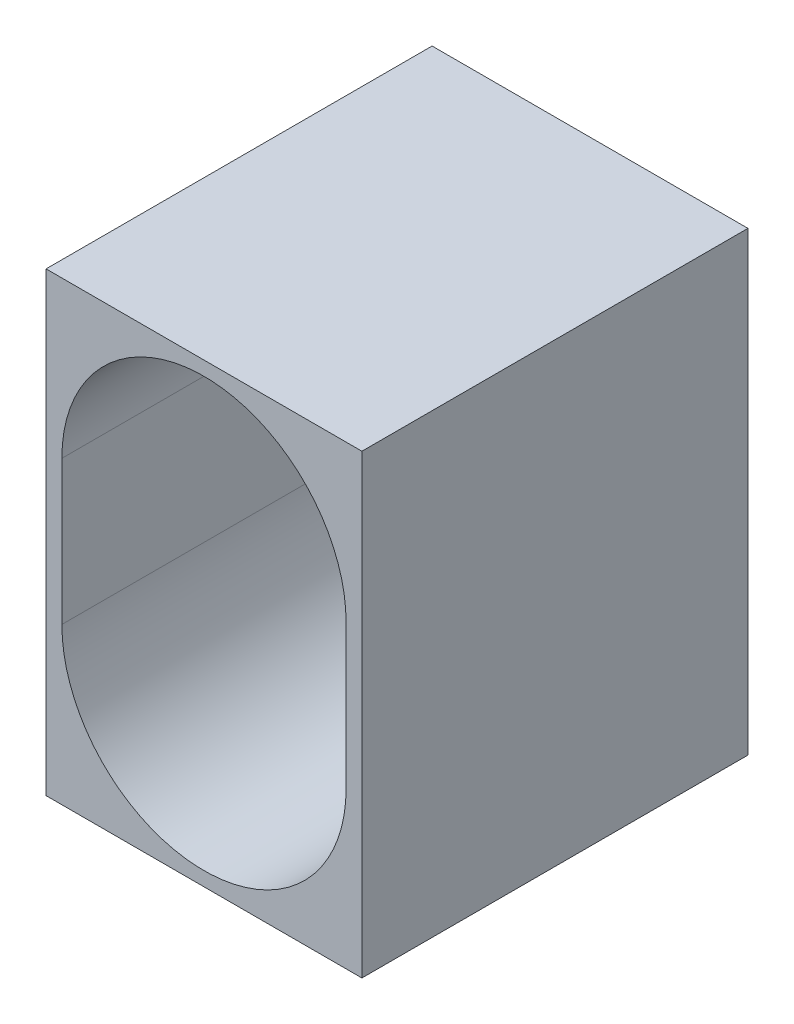
ISO-10303-21;
HEADER;
FILE_DESCRIPTION(('STEP AP214'),'2;1');
FILE_NAME('part.step','',(''),(''),'','','');
FILE_SCHEMA(('AUTOMOTIVE_DESIGN { 1 0 10303 214 1 1 1 1 }'));
ENDSEC;
DATA;
#1=APPLICATION_CONTEXT('core data for automotive mechanical design processes');
#2=APPLICATION_PROTOCOL_DEFINITION('international standard','automotive_design',2000,#1);
#3=PRODUCT_CONTEXT('',#1,'mechanical');
#4=PRODUCT('Part','Part','',(#3));
#5=PRODUCT_RELATED_PRODUCT_CATEGORY('part','',(#4));
#6=PRODUCT_DEFINITION_FORMATION('','',#4);
#7=PRODUCT_DEFINITION_CONTEXT('part definition',#1,'design');
#8=PRODUCT_DEFINITION('design','',#6,#7);
#9=PRODUCT_DEFINITION_SHAPE('','',#8);
#10=(LENGTH_UNIT() NAMED_UNIT(*) SI_UNIT(.MILLI.,.METRE.));
#11=(NAMED_UNIT(*) PLANE_ANGLE_UNIT() SI_UNIT($,.RADIAN.));
#12=(NAMED_UNIT(*) SI_UNIT($,.STERADIAN.) SOLID_ANGLE_UNIT());
#13=UNCERTAINTY_MEASURE_WITH_UNIT(LENGTH_MEASURE(1.E-05),#10,'distance_accuracy_value','');
#14=(GEOMETRIC_REPRESENTATION_CONTEXT(3) GLOBAL_UNCERTAINTY_ASSIGNED_CONTEXT((#13)) GLOBAL_UNIT_ASSIGNED_CONTEXT((#10,
#11,#12)) REPRESENTATION_CONTEXT('',''));
#15=CARTESIAN_POINT('',(0.,0.,0.));
#16=DIRECTION('',(0.,0.,1.));
#17=DIRECTION('',(1.,0.,0.));
#18=AXIS2_PLACEMENT_3D('',#15,#16,#17);
#19=CARTESIAN_POINT('',(-30.284904397773,20.560708190514,55.));
#20=DIRECTION('',(1.,0.,0.));
#21=DIRECTION('',(0.,1.,0.));
#22=AXIS2_PLACEMENT_3D('',#19,#20,#21);
#23=PLANE('',#22);
#24=DIRECTION('',(0.,-1.,0.));
#25=VECTOR('',#24,1.);
#26=CARTESIAN_POINT('',(-30.284904397773,20.560708190514,0.));
#27=LINE('',#26,#25);
#28=CARTESIAN_POINT('',(-30.284904397773,20.560708190514,0.));
#29=VERTEX_POINT('',#28);
#30=CARTESIAN_POINT('',(-30.2849043977729,-44.439291809486,0.));
#31=VERTEX_POINT('',#30);
#32=EDGE_CURVE('E186',#29,#31,#27,.T.);
#33=ORIENTED_EDGE('',*,*,#32,.T.);
#34=DIRECTION('',(0.,0.,-1.));
#35=VECTOR('',#34,1.);
#36=CARTESIAN_POINT('',(-30.2849043977729,-44.439291809486,55.));
#37=LINE('',#36,#35);
#38=CARTESIAN_POINT('',(-30.2849043977729,-44.439291809486,55.));
#39=VERTEX_POINT('',#38);
#40=EDGE_CURVE('E11',#39,#31,#37,.T.);
#41=ORIENTED_EDGE('',*,*,#40,.F.);
#42=DIRECTION('',(0.,-1.,0.));
#43=VECTOR('',#42,1.);
#44=CARTESIAN_POINT('',(-30.284904397773,20.560708190514,55.));
#45=LINE('',#44,#43);
#46=CARTESIAN_POINT('',(-30.284904397773,20.560708190514,55.));
#47=VERTEX_POINT('',#46);
#48=EDGE_CURVE('E195',#47,#39,#45,.T.);
#49=ORIENTED_EDGE('',*,*,#48,.F.);
#50=DIRECTION('',(0.,0.,-1.));
#51=VECTOR('',#50,1.);
#52=CARTESIAN_POINT('',(-30.284904397773,20.560708190514,55.));
#53=LINE('',#52,#51);
#54=EDGE_CURVE('E205',#47,#29,#53,.T.);
#55=ORIENTED_EDGE('',*,*,#54,.T.);
#56=EDGE_LOOP('',(#33,#41,#49,#55));
#57=FACE_BOUND('',#56,.T.);
#58=ADVANCED_FACE('F41',(#57),#23,.F.);
#59=CARTESIAN_POINT('',(-30.2849043977729,-44.439291809486,55.));
#60=DIRECTION('',(0.,1.,0.));
#61=DIRECTION('',(0.,0.,1.));
#62=AXIS2_PLACEMENT_3D('',#59,#60,#61);
#63=PLANE('',#62);
#64=DIRECTION('',(1.,0.,0.));
#65=VECTOR('',#64,1.);
#66=CARTESIAN_POINT('',(-30.2849043977729,-44.439291809486,0.));
#67=LINE('',#66,#65);
#68=CARTESIAN_POINT('',(14.7150956022271,-44.439291809486,0.));
#69=VERTEX_POINT('',#68);
#70=EDGE_CURVE('E209',#31,#69,#67,.T.);
#71=ORIENTED_EDGE('',*,*,#70,.T.);
#72=DIRECTION('',(0.,0.,-1.));
#73=VECTOR('',#72,1.);
#74=CARTESIAN_POINT('',(14.7150956022271,-44.439291809486,55.));
#75=LINE('',#74,#73);
#76=CARTESIAN_POINT('',(14.7150956022271,-44.439291809486,55.));
#77=VERTEX_POINT('',#76);
#78=EDGE_CURVE('E49',#77,#69,#75,.T.);
#79=ORIENTED_EDGE('',*,*,#78,.F.);
#80=DIRECTION('',(1.,0.,0.));
#81=VECTOR('',#80,1.);
#82=CARTESIAN_POINT('',(-30.2849043977729,-44.439291809486,55.));
#83=LINE('',#82,#81);
#84=EDGE_CURVE('E93',#39,#77,#83,.T.);
#85=ORIENTED_EDGE('',*,*,#84,.F.);
#86=ORIENTED_EDGE('',*,*,#40,.T.);
#87=EDGE_LOOP('',(#71,#79,#85,#86));
#88=FACE_BOUND('',#87,.T.);
#89=ADVANCED_FACE('F244',(#88),#63,.F.);
#90=CARTESIAN_POINT('',(14.715095602227,20.560708190514,55.));
#91=DIRECTION('',(-1.,0.,0.));
#92=DIRECTION('',(0.,-1.,0.));
#93=AXIS2_PLACEMENT_3D('',#90,#91,#92);
#94=PLANE('',#93);
#95=DIRECTION('',(0.,1.,0.));
#96=VECTOR('',#95,1.);
#97=CARTESIAN_POINT('',(14.715095602227,20.560708190514,0.));
#98=LINE('',#97,#96);
#99=CARTESIAN_POINT('',(14.715095602227,20.560708190514,0.));
#100=VERTEX_POINT('',#99);
#101=EDGE_CURVE('E212',#69,#100,#98,.T.);
#102=ORIENTED_EDGE('',*,*,#101,.T.);
#103=DIRECTION('',(0.,0.,-1.));
#104=VECTOR('',#103,1.);
#105=CARTESIAN_POINT('',(14.715095602227,20.560708190514,55.));
#106=LINE('',#105,#104);
#107=CARTESIAN_POINT('',(14.715095602227,20.560708190514,55.));
#108=VERTEX_POINT('',#107);
#109=EDGE_CURVE('E219',#108,#100,#106,.T.);
#110=ORIENTED_EDGE('',*,*,#109,.F.);
#111=DIRECTION('',(0.,1.,0.));
#112=VECTOR('',#111,1.);
#113=CARTESIAN_POINT('',(14.715095602227,20.560708190514,55.));
#114=LINE('',#113,#112);
#115=EDGE_CURVE('E200',#77,#108,#114,.T.);
#116=ORIENTED_EDGE('',*,*,#115,.F.);
#117=ORIENTED_EDGE('',*,*,#78,.T.);
#118=EDGE_LOOP('',(#102,#110,#116,#117));
#119=FACE_BOUND('',#118,.T.);
#120=ADVANCED_FACE('F226',(#119),#94,.F.);
#121=CARTESIAN_POINT('',(-30.284904397773,20.560708190514,55.));
#122=DIRECTION('',(0.,-1.,0.));
#123=DIRECTION('',(0.,0.,-1.));
#124=AXIS2_PLACEMENT_3D('',#121,#122,#123);
#125=PLANE('',#124);
#126=DIRECTION('',(-1.,0.,0.));
#127=VECTOR('',#126,1.);
#128=CARTESIAN_POINT('',(-30.284904397773,20.560708190514,0.));
#129=LINE('',#128,#127);
#130=EDGE_CURVE('E86',#100,#29,#129,.T.);
#131=ORIENTED_EDGE('',*,*,#130,.T.);
#132=ORIENTED_EDGE('',*,*,#54,.F.);
#133=DIRECTION('',(-1.,0.,0.));
#134=VECTOR('',#133,1.);
#135=CARTESIAN_POINT('',(-30.284904397773,20.560708190514,55.));
#136=LINE('',#135,#134);
#137=EDGE_CURVE('E65',#108,#47,#136,.T.);
#138=ORIENTED_EDGE('',*,*,#137,.F.);
#139=ORIENTED_EDGE('',*,*,#109,.T.);
#140=EDGE_LOOP('',(#131,#132,#138,#139));
#141=FACE_BOUND('',#140,.T.);
#142=ADVANCED_FACE('F234',(#141),#125,.F.);
#143=CARTESIAN_POINT('',(0.,0.,55.));
#144=DIRECTION('',(0.,0.,1.));
#145=DIRECTION('',(1.,0.,0.));
#146=AXIS2_PLACEMENT_3D('',#143,#144,#145);
#147=PLANE('',#146);
#148=CARTESIAN_POINT('',(-7.78490439777296,-22.189291809486,55.));
#149=DIRECTION('',(0.,0.,1.));
#150=DIRECTION('',(1.,0.,0.));
#151=AXIS2_PLACEMENT_3D('',#148,#149,#150);
#152=CIRCLE('',#151,20.25);
#153=CARTESIAN_POINT('',(-28.034904397773,-22.189291809486,55.));
#154=VERTEX_POINT('',#153);
#155=CARTESIAN_POINT('',(12.465095602227,-22.189291809486,55.));
#156=VERTEX_POINT('',#155);
#157=EDGE_CURVE('E56',#154,#156,#152,.T.);
#158=ORIENTED_EDGE('',*,*,#157,.F.);
#159=DIRECTION('',(0.,-1.,0.));
#160=VECTOR('',#159,1.);
#161=CARTESIAN_POINT('',(-28.034904397773,-22.189291809486,55.));
#162=LINE('',#161,#160);
#163=CARTESIAN_POINT('',(-28.034904397773,-1.68929180948604,55.));
#164=VERTEX_POINT('',#163);
#165=EDGE_CURVE('E157',#164,#154,#162,.T.);
#166=ORIENTED_EDGE('',*,*,#165,.F.);
#167=CARTESIAN_POINT('',(-7.78490439777296,-1.68929180948602,55.));
#168=DIRECTION('',(0.,0.,1.));
#169=DIRECTION('',(1.,0.,0.));
#170=AXIS2_PLACEMENT_3D('',#167,#168,#169);
#171=CIRCLE('',#170,20.25);
#172=CARTESIAN_POINT('',(12.465095602227,-1.689291809486,55.));
#173=VERTEX_POINT('',#172);
#174=EDGE_CURVE('E176',#173,#164,#171,.T.);
#175=ORIENTED_EDGE('',*,*,#174,.F.);
#176=DIRECTION('',(0.,1.,0.));
#177=VECTOR('',#176,1.);
#178=CARTESIAN_POINT('',(12.465095602227,-22.189291809486,55.));
#179=LINE('',#178,#177);
#180=EDGE_CURVE('E172',#156,#173,#179,.T.);
#181=ORIENTED_EDGE('',*,*,#180,.F.);
#182=EDGE_LOOP('',(#158,#166,#175,#181));
#183=FACE_BOUND('',#182,.T.);
#184=ORIENTED_EDGE('',*,*,#48,.T.);
#185=ORIENTED_EDGE('',*,*,#84,.T.);
#186=ORIENTED_EDGE('',*,*,#115,.T.);
#187=ORIENTED_EDGE('',*,*,#137,.T.);
#188=EDGE_LOOP('',(#184,#185,#186,#187));
#189=FACE_BOUND('',#188,.T.);
#190=ADVANCED_FACE('F236',(#183,#189),#147,.T.);
#191=CARTESIAN_POINT('',(0.,0.,0.));
#192=DIRECTION('',(0.,0.,1.));
#193=DIRECTION('',(1.,0.,0.));
#194=AXIS2_PLACEMENT_3D('',#191,#192,#193);
#195=PLANE('',#194);
#196=CARTESIAN_POINT('',(-26.2849043977729,-40.439291809486,0.));
#197=DIRECTION('',(0.,0.,-1.));
#198=DIRECTION('',(-1.,0.,0.));
#199=AXIS2_PLACEMENT_3D('',#196,#197,#198);
#200=CIRCLE('',#199,0.799999999999992);
#201=CARTESIAN_POINT('',(-27.0849043977729,-40.439291809486,0.));
#202=VERTEX_POINT('',#201);
#203=EDGE_CURVE('E131',#202,#202,#200,.T.);
#204=ORIENTED_EDGE('',*,*,#203,.F.);
#205=EDGE_LOOP('',(#204));
#206=FACE_BOUND('',#205,.T.);
#207=CARTESIAN_POINT('',(10.715095602227,-40.439291809486,0.));
#208=DIRECTION('',(0.,0.,-1.));
#209=DIRECTION('',(-1.,0.,0.));
#210=AXIS2_PLACEMENT_3D('',#207,#208,#209);
#211=CIRCLE('',#210,0.79999999999999);
#212=CARTESIAN_POINT('',(9.91509560222706,-40.439291809486,0.));
#213=VERTEX_POINT('',#212);
#214=EDGE_CURVE('E130',#213,#213,#211,.T.);
#215=ORIENTED_EDGE('',*,*,#214,.F.);
#216=EDGE_LOOP('',(#215));
#217=FACE_BOUND('',#216,.T.);
#218=CARTESIAN_POINT('',(-7.78490439777295,-16.439291809486,0.));
#219=DIRECTION('',(0.,0.,-1.));
#220=DIRECTION('',(-1.,0.,0.));
#221=AXIS2_PLACEMENT_3D('',#218,#219,#220);
#222=CIRCLE('',#221,2.70509999999999);
#223=CARTESIAN_POINT('',(-10.4900043977729,-16.439291809486,0.));
#224=VERTEX_POINT('',#223);
#225=EDGE_CURVE('E144',#224,#224,#222,.T.);
#226=ORIENTED_EDGE('',*,*,#225,.F.);
#227=EDGE_LOOP('',(#226));
#228=FACE_BOUND('',#227,.T.);
#229=ORIENTED_EDGE('',*,*,#32,.F.);
#230=ORIENTED_EDGE('',*,*,#130,.F.);
#231=ORIENTED_EDGE('',*,*,#101,.F.);
#232=ORIENTED_EDGE('',*,*,#70,.F.);
#233=EDGE_LOOP('',(#229,#230,#231,#232));
#234=FACE_BOUND('',#233,.T.);
#235=ADVANCED_FACE('F230',(#206,#217,#228,#234),#195,.F.);
#236=CARTESIAN_POINT('',(-7.78490439777296,-22.189291809486,2.5));
#237=DIRECTION('',(0.,0.,1.));
#238=DIRECTION('',(1.,0.,0.));
#239=AXIS2_PLACEMENT_3D('',#236,#237,#238);
#240=CYLINDRICAL_SURFACE('',#239,20.25);
#241=ORIENTED_EDGE('',*,*,#157,.T.);
#242=DIRECTION('',(0.,0.,1.));
#243=VECTOR('',#242,1.);
#244=CARTESIAN_POINT('',(12.465095602227,-22.189291809486,2.5));
#245=LINE('',#244,#243);
#246=CARTESIAN_POINT('',(12.465095602227,-22.189291809486,2.5));
#247=VERTEX_POINT('',#246);
#248=EDGE_CURVE('E169',#247,#156,#245,.T.);
#249=ORIENTED_EDGE('',*,*,#248,.F.);
#250=CARTESIAN_POINT('',(-7.78490439777296,-22.189291809486,2.5));
#251=DIRECTION('',(0.,0.,1.));
#252=DIRECTION('',(1.,0.,0.));
#253=AXIS2_PLACEMENT_3D('',#250,#251,#252);
#254=CIRCLE('',#253,20.25);
#255=CARTESIAN_POINT('',(-28.034904397773,-22.189291809486,2.5));
#256=VERTEX_POINT('',#255);
#257=EDGE_CURVE('E152',#256,#247,#254,.T.);
#258=ORIENTED_EDGE('',*,*,#257,.F.);
#259=DIRECTION('',(0.,0.,1.));
#260=VECTOR('',#259,1.);
#261=CARTESIAN_POINT('',(-28.034904397773,-22.189291809486,2.5));
#262=LINE('',#261,#260);
#263=EDGE_CURVE('E183',#256,#154,#262,.T.);
#264=ORIENTED_EDGE('',*,*,#263,.T.);
#265=EDGE_LOOP('',(#241,#249,#258,#264));
#266=FACE_BOUND('',#265,.T.);
#267=ADVANCED_FACE('F274',(#266),#240,.F.);
#268=CARTESIAN_POINT('',(-28.034904397773,-22.189291809486,2.5));
#269=DIRECTION('',(-1.,0.,0.));
#270=DIRECTION('',(0.,0.,1.));
#271=AXIS2_PLACEMENT_3D('',#268,#269,#270);
#272=PLANE('',#271);
#273=ORIENTED_EDGE('',*,*,#165,.T.);
#274=ORIENTED_EDGE('',*,*,#263,.F.);
#275=DIRECTION('',(0.,-1.,0.));
#276=VECTOR('',#275,1.);
#277=CARTESIAN_POINT('',(-28.034904397773,-22.189291809486,2.5));
#278=LINE('',#277,#276);
#279=CARTESIAN_POINT('',(-28.034904397773,-1.68929180948604,2.5));
#280=VERTEX_POINT('',#279);
#281=EDGE_CURVE('E165',#280,#256,#278,.T.);
#282=ORIENTED_EDGE('',*,*,#281,.F.);
#283=DIRECTION('',(0.,0.,1.));
#284=VECTOR('',#283,1.);
#285=CARTESIAN_POINT('',(-28.034904397773,-1.68929180948604,2.5));
#286=LINE('',#285,#284);
#287=EDGE_CURVE('E187',#280,#164,#286,.T.);
#288=ORIENTED_EDGE('',*,*,#287,.T.);
#289=EDGE_LOOP('',(#273,#274,#282,#288));
#290=FACE_BOUND('',#289,.T.);
#291=ADVANCED_FACE('F279',(#290),#272,.F.);
#292=CARTESIAN_POINT('',(-7.78490439777296,-1.68929180948602,2.5));
#293=DIRECTION('',(0.,0.,1.));
#294=DIRECTION('',(1.,0.,0.));
#295=AXIS2_PLACEMENT_3D('',#292,#293,#294);
#296=CYLINDRICAL_SURFACE('',#295,20.25);
#297=ORIENTED_EDGE('',*,*,#174,.T.);
#298=ORIENTED_EDGE('',*,*,#287,.F.);
#299=CARTESIAN_POINT('',(-7.78490439777296,-1.68929180948602,2.5));
#300=DIRECTION('',(0.,0.,1.));
#301=DIRECTION('',(1.,0.,0.));
#302=AXIS2_PLACEMENT_3D('',#299,#300,#301);
#303=CIRCLE('',#302,20.25);
#304=CARTESIAN_POINT('',(12.465095602227,-1.689291809486,2.5));
#305=VERTEX_POINT('',#304);
#306=EDGE_CURVE('E161',#305,#280,#303,.T.);
#307=ORIENTED_EDGE('',*,*,#306,.F.);
#308=DIRECTION('',(0.,0.,1.));
#309=VECTOR('',#308,1.);
#310=CARTESIAN_POINT('',(12.465095602227,-1.689291809486,2.5));
#311=LINE('',#310,#309);
#312=EDGE_CURVE('E190',#305,#173,#311,.T.);
#313=ORIENTED_EDGE('',*,*,#312,.T.);
#314=EDGE_LOOP('',(#297,#298,#307,#313));
#315=FACE_BOUND('',#314,.T.);
#316=ADVANCED_FACE('F288',(#315),#296,.F.);
#317=CARTESIAN_POINT('',(12.465095602227,-22.189291809486,2.5));
#318=DIRECTION('',(1.,0.,0.));
#319=DIRECTION('',(0.,1.,0.));
#320=AXIS2_PLACEMENT_3D('',#317,#318,#319);
#321=PLANE('',#320);
#322=ORIENTED_EDGE('',*,*,#180,.T.);
#323=ORIENTED_EDGE('',*,*,#312,.F.);
#324=DIRECTION('',(0.,1.,0.));
#325=VECTOR('',#324,1.);
#326=CARTESIAN_POINT('',(12.465095602227,-22.189291809486,2.5));
#327=LINE('',#326,#325);
#328=EDGE_CURVE('E156',#247,#305,#327,.T.);
#329=ORIENTED_EDGE('',*,*,#328,.F.);
#330=ORIENTED_EDGE('',*,*,#248,.T.);
#331=EDGE_LOOP('',(#322,#323,#329,#330));
#332=FACE_BOUND('',#331,.T.);
#333=ADVANCED_FACE('F298',(#332),#321,.F.);
#334=CARTESIAN_POINT('',(-7.78490439777296,-22.189291809486,2.5));
#335=DIRECTION('',(0.,0.,1.));
#336=DIRECTION('',(1.,0.,0.));
#337=AXIS2_PLACEMENT_3D('',#334,#335,#336);
#338=PLANE('',#337);
#339=CARTESIAN_POINT('',(-7.78490439777295,-16.439291809486,2.5));
#340=DIRECTION('',(0.,0.,1.));
#341=DIRECTION('',(1.,0.,0.));
#342=AXIS2_PLACEMENT_3D('',#339,#340,#341);
#343=CIRCLE('',#342,2.70509999999999);
#344=CARTESIAN_POINT('',(-5.07980439777296,-16.439291809486,2.5));
#345=VERTEX_POINT('',#344);
#346=EDGE_CURVE('E148',#345,#345,#343,.T.);
#347=ORIENTED_EDGE('',*,*,#346,.F.);
#348=EDGE_LOOP('',(#347));
#349=FACE_BOUND('',#348,.T.);
#350=ORIENTED_EDGE('',*,*,#257,.T.);
#351=ORIENTED_EDGE('',*,*,#328,.T.);
#352=ORIENTED_EDGE('',*,*,#306,.T.);
#353=ORIENTED_EDGE('',*,*,#281,.T.);
#354=EDGE_LOOP('',(#350,#351,#352,#353));
#355=FACE_BOUND('',#354,.T.);
#356=ADVANCED_FACE('F308',(#349,#355),#338,.T.);
#357=CARTESIAN_POINT('',(-7.78490439777295,-16.439291809486,0.));
#358=DIRECTION('',(0.,0.,-1.));
#359=DIRECTION('',(-1.,0.,0.));
#360=AXIS2_PLACEMENT_3D('',#357,#358,#359);
#361=CYLINDRICAL_SURFACE('',#360,2.70509999999999);
#362=ORIENTED_EDGE('',*,*,#225,.T.);
#363=EDGE_LOOP('',(#362));
#364=FACE_BOUND('',#363,.T.);
#365=ORIENTED_EDGE('',*,*,#346,.T.);
#366=EDGE_LOOP('',(#365));
#367=FACE_BOUND('',#366,.T.);
#368=ADVANCED_FACE('F318',(#364,#367),#361,.F.);
#369=CARTESIAN_POINT('',(10.715095602227,-40.439291809486,7.99999999999999));
#370=DIRECTION('',(0.,0.,-1.));
#371=DIRECTION('',(-1.,0.,0.));
#372=AXIS2_PLACEMENT_3D('',#369,#370,#371);
#373=CONICAL_SURFACE('',#372,0.799999999999988,1.02974425867664);
#374=CARTESIAN_POINT('',(10.715095602227,-40.439291809486,8.48068849522205));
#375=VERTEX_POINT('',#374);
#376=VERTEX_LOOP('',#375);
#377=FACE_BOUND('',#376,.T.);
#378=CARTESIAN_POINT('',(10.715095602227,-40.439291809486,7.99999999999999));
#379=DIRECTION('',(0.,0.,-1.));
#380=DIRECTION('',(-1.,0.,0.));
#381=AXIS2_PLACEMENT_3D('',#378,#379,#380);
#382=CIRCLE('',#381,0.799999999999988);
#383=CARTESIAN_POINT('',(9.91509560222706,-40.439291809486,7.99999999999999));
#384=VERTEX_POINT('',#383);
#385=EDGE_CURVE('E136',#384,#384,#382,.T.);
#386=ORIENTED_EDGE('',*,*,#385,.T.);
#387=EDGE_LOOP('',(#386));
#388=FACE_BOUND('',#387,.T.);
#389=ADVANCED_FACE('F329',(#377,#388),#373,.F.);
#390=CARTESIAN_POINT('',(10.715095602227,-40.439291809486,0.));
#391=DIRECTION('',(0.,0.,-1.));
#392=DIRECTION('',(-1.,0.,0.));
#393=AXIS2_PLACEMENT_3D('',#390,#391,#392);
#394=CYLINDRICAL_SURFACE('',#393,0.799999999999989);
#395=ORIENTED_EDGE('',*,*,#385,.F.);
#396=EDGE_LOOP('',(#395));
#397=FACE_BOUND('',#396,.T.);
#398=ORIENTED_EDGE('',*,*,#214,.T.);
#399=EDGE_LOOP('',(#398));
#400=FACE_BOUND('',#399,.T.);
#401=ADVANCED_FACE('F123',(#397,#400),#394,.F.);
#402=CARTESIAN_POINT('',(-26.2849043977729,-40.439291809486,7.99999999999999));
#403=DIRECTION('',(0.,0.,-1.));
#404=DIRECTION('',(-1.,0.,0.));
#405=AXIS2_PLACEMENT_3D('',#402,#403,#404);
#406=CONICAL_SURFACE('',#405,0.799999999999988,1.02974425867664);
#407=CARTESIAN_POINT('',(-26.284904397773,-40.439291809486,8.48068849522205));
#408=VERTEX_POINT('',#407);
#409=VERTEX_LOOP('',#408);
#410=FACE_BOUND('',#409,.T.);
#411=CARTESIAN_POINT('',(-26.2849043977729,-40.439291809486,7.99999999999999));
#412=DIRECTION('',(0.,0.,-1.));
#413=DIRECTION('',(-1.,0.,0.));
#414=AXIS2_PLACEMENT_3D('',#411,#412,#413);
#415=CIRCLE('',#414,0.799999999999988);
#416=CARTESIAN_POINT('',(-27.0849043977729,-40.439291809486,7.99999999999999));
#417=VERTEX_POINT('',#416);
#418=EDGE_CURVE('E127',#417,#417,#415,.T.);
#419=ORIENTED_EDGE('',*,*,#418,.T.);
#420=EDGE_LOOP('',(#419));
#421=FACE_BOUND('',#420,.T.);
#422=ADVANCED_FACE('F119',(#410,#421),#406,.F.);
#423=CARTESIAN_POINT('',(-26.2849043977729,-40.439291809486,0.));
#424=DIRECTION('',(0.,0.,-1.));
#425=DIRECTION('',(-1.,0.,0.));
#426=AXIS2_PLACEMENT_3D('',#423,#424,#425);
#427=CYLINDRICAL_SURFACE('',#426,0.79999999999999);
#428=ORIENTED_EDGE('',*,*,#418,.F.);
#429=EDGE_LOOP('',(#428));
#430=FACE_BOUND('',#429,.T.);
#431=ORIENTED_EDGE('',*,*,#203,.T.);
#432=EDGE_LOOP('',(#431));
#433=FACE_BOUND('',#432,.T.);
#434=ADVANCED_FACE('F122',(#430,#433),#427,.F.);
#435=CLOSED_SHELL('',(#58,#89,#120,#142,#190,#235,#267,#291,#316,#333,#356,#368,#389,#401,#422,#434));
#436=MANIFOLD_SOLID_BREP('B2',#435);
#437=ADVANCED_BREP_SHAPE_REPRESENTATION('',(#18,#436),#14);
#438=SHAPE_DEFINITION_REPRESENTATION(#9,#437);
ENDSEC;
END-ISO-10303-21;
